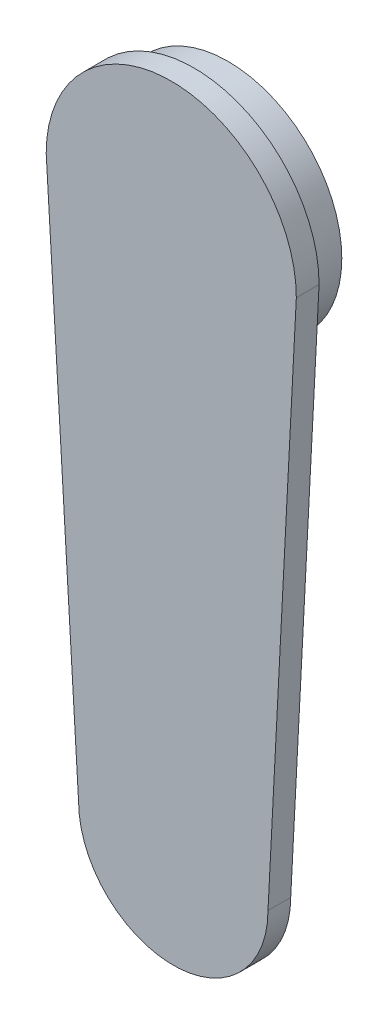
ISO-10303-21;
HEADER;
FILE_DESCRIPTION(('STEP AP214'),'2;1');
FILE_NAME('part.step','',(''),(''),'','','');
FILE_SCHEMA(('AUTOMOTIVE_DESIGN { 1 0 10303 214 1 1 1 1 }'));
ENDSEC;
DATA;
#1=APPLICATION_CONTEXT('core data for automotive mechanical design processes');
#2=APPLICATION_PROTOCOL_DEFINITION('international standard','automotive_design',2000,#1);
#3=PRODUCT_CONTEXT('',#1,'mechanical');
#4=PRODUCT('Part','Part','',(#3));
#5=PRODUCT_RELATED_PRODUCT_CATEGORY('part','',(#4));
#6=PRODUCT_DEFINITION_FORMATION('','',#4);
#7=PRODUCT_DEFINITION_CONTEXT('part definition',#1,'design');
#8=PRODUCT_DEFINITION('design','',#6,#7);
#9=PRODUCT_DEFINITION_SHAPE('','',#8);
#10=(LENGTH_UNIT() NAMED_UNIT(*) SI_UNIT(.MILLI.,.METRE.));
#11=(NAMED_UNIT(*) PLANE_ANGLE_UNIT() SI_UNIT($,.RADIAN.));
#12=(NAMED_UNIT(*) SI_UNIT($,.STERADIAN.) SOLID_ANGLE_UNIT());
#13=UNCERTAINTY_MEASURE_WITH_UNIT(LENGTH_MEASURE(1.E-05),#10,'distance_accuracy_value','');
#14=(GEOMETRIC_REPRESENTATION_CONTEXT(3) GLOBAL_UNCERTAINTY_ASSIGNED_CONTEXT((#13)) GLOBAL_UNIT_ASSIGNED_CONTEXT((#10,
#11,#12)) REPRESENTATION_CONTEXT('',''));
#15=CARTESIAN_POINT('',(0.,0.,0.));
#16=DIRECTION('',(0.,0.,1.));
#17=DIRECTION('',(1.,0.,0.));
#18=AXIS2_PLACEMENT_3D('',#15,#16,#17);
#19=CARTESIAN_POINT('',(54.8515641225065,-2.8534084972915,-0.0001));
#20=DIRECTION('',(0.998649671237995,-0.0519503044865522,0.));
#21=DIRECTION('',(0.0519503044865522,0.998649671237995,0.));
#22=AXIS2_PLACEMENT_3D('',#19,#20,#21);
#23=PLANE('',#22);
#24=DIRECTION('',(0.,0.,1.));
#25=VECTOR('',#24,1.);
#26=CARTESIAN_POINT('',(55.,0.,-0.0001));
#27=LINE('',#26,#25);
#28=CARTESIAN_POINT('',(55.,0.,-0.0001));
#29=VERTEX_POINT('',#28);
#30=CARTESIAN_POINT('',(55.,0.,10.));
#31=VERTEX_POINT('',#30);
#32=EDGE_CURVE('E73',#29,#31,#27,.T.);
#33=ORIENTED_EDGE('',*,*,#32,.T.);
#34=DIRECTION('',(0.0519503044865522,0.998649671237995,0.));
#35=VECTOR('',#34,1.);
#36=CARTESIAN_POINT('',(54.8515641225065,-2.8534084972915,10.));
#37=LINE('',#36,#35);
#38=CARTESIAN_POINT('',(42.5319269232275,-239.675921097119,10.));
#39=VERTEX_POINT('',#38);
#40=EDGE_CURVE('E76',#39,#31,#37,.T.);
#41=ORIENTED_EDGE('',*,*,#40,.F.);
#42=DIRECTION('',(0.,0.,1.));
#43=VECTOR('',#42,1.);
#44=CARTESIAN_POINT('',(42.5319269232275,-239.675921097119,-0.0001));
#45=LINE('',#44,#43);
#46=CARTESIAN_POINT('',(42.5319269232275,-239.675921097119,-0.0001));
#47=VERTEX_POINT('',#46);
#48=EDGE_CURVE('E42',#47,#39,#45,.T.);
#49=ORIENTED_EDGE('',*,*,#48,.F.);
#50=DIRECTION('',(0.0519503044865522,0.998649671237995,0.));
#51=VECTOR('',#50,1.);
#52=CARTESIAN_POINT('',(54.8515641225065,-2.8534084972915,-0.0001));
#53=LINE('',#52,#51);
#54=EDGE_CURVE('E77',#47,#29,#53,.T.);
#55=ORIENTED_EDGE('',*,*,#54,.T.);
#56=EDGE_LOOP('',(#33,#41,#49,#55));
#57=FACE_BOUND('',#56,.T.);
#58=ADVANCED_FACE('F35',(#57),#23,.T.);
#59=CARTESIAN_POINT('',(0.881926923227479,-239.675921097119,-0.0001));
#60=DIRECTION('',(0.,0.,1.));
#61=DIRECTION('',(1.,0.,0.));
#62=AXIS2_PLACEMENT_3D('',#59,#60,#61);
#63=CYLINDRICAL_SURFACE('',#62,41.65);
#64=ORIENTED_EDGE('',*,*,#48,.T.);
#65=CARTESIAN_POINT('',(0.881926923227479,-239.675921097119,10.));
#66=DIRECTION('',(0.,0.,1.));
#67=DIRECTION('',(1.,0.,0.));
#68=AXIS2_PLACEMENT_3D('',#65,#66,#67);
#69=CIRCLE('',#68,41.65);
#70=CARTESIAN_POINT('',(-40.7680730767725,-239.675921097119,10.));
#71=VERTEX_POINT('',#70);
#72=EDGE_CURVE('E93',#71,#39,#69,.T.);
#73=ORIENTED_EDGE('',*,*,#72,.F.);
#74=DIRECTION('',(0.,0.,1.));
#75=VECTOR('',#74,1.);
#76=CARTESIAN_POINT('',(-40.7680730767725,-239.675921097119,-0.0001));
#77=LINE('',#76,#75);
#78=CARTESIAN_POINT('',(-40.7680730767725,-239.675921097119,-0.0001));
#79=VERTEX_POINT('',#78);
#80=EDGE_CURVE('E56',#79,#71,#77,.T.);
#81=ORIENTED_EDGE('',*,*,#80,.F.);
#82=CARTESIAN_POINT('',(0.881926923227479,-239.675921097119,-0.0001));
#83=DIRECTION('',(0.,0.,1.));
#84=DIRECTION('',(1.,0.,0.));
#85=AXIS2_PLACEMENT_3D('',#82,#83,#84);
#86=CIRCLE('',#85,41.65);
#87=EDGE_CURVE('E82',#79,#47,#86,.T.);
#88=ORIENTED_EDGE('',*,*,#87,.T.);
#89=EDGE_LOOP('',(#64,#73,#81,#88));
#90=FACE_BOUND('',#89,.T.);
#91=ADVANCED_FACE('F113',(#90),#63,.T.);
#92=CARTESIAN_POINT('',(-54.8067530386932,-3.25441830191191,-0.0001));
#93=DIRECTION('',(-0.998241663569164,-0.0592754680679025,0.));
#94=DIRECTION('',(0.0592754680679025,-0.998241663569164,0.));
#95=AXIS2_PLACEMENT_3D('',#92,#93,#94);
#96=PLANE('',#95);
#97=ORIENTED_EDGE('',*,*,#80,.T.);
#98=DIRECTION('',(0.0592754680679025,-0.998241663569164,0.));
#99=VECTOR('',#98,1.);
#100=CARTESIAN_POINT('',(-54.8067530386932,-3.25441830191191,10.));
#101=LINE('',#100,#99);
#102=CARTESIAN_POINT('',(-55.,0.,10.));
#103=VERTEX_POINT('',#102);
#104=EDGE_CURVE('E89',#103,#71,#101,.T.);
#105=ORIENTED_EDGE('',*,*,#104,.F.);
#106=DIRECTION('',(0.,0.,1.));
#107=VECTOR('',#106,1.);
#108=CARTESIAN_POINT('',(-55.,0.,-0.0001));
#109=LINE('',#108,#107);
#110=CARTESIAN_POINT('',(-55.,0.,-0.0001));
#111=VERTEX_POINT('',#110);
#112=EDGE_CURVE('E81',#111,#103,#109,.T.);
#113=ORIENTED_EDGE('',*,*,#112,.F.);
#114=DIRECTION('',(0.0592754680679025,-0.998241663569164,0.));
#115=VECTOR('',#114,1.);
#116=CARTESIAN_POINT('',(-54.8067530386932,-3.25441830191191,-0.0001));
#117=LINE('',#116,#115);
#118=EDGE_CURVE('E104',#111,#79,#117,.T.);
#119=ORIENTED_EDGE('',*,*,#118,.T.);
#120=EDGE_LOOP('',(#97,#105,#113,#119));
#121=FACE_BOUND('',#120,.T.);
#122=ADVANCED_FACE('F110',(#121),#96,.T.);
#123=CARTESIAN_POINT('',(0.,0.,-0.0001));
#124=DIRECTION('',(0.,0.,1.));
#125=DIRECTION('',(1.,0.,0.));
#126=AXIS2_PLACEMENT_3D('',#123,#124,#125);
#127=CYLINDRICAL_SURFACE('',#126,55.);
#128=ORIENTED_EDGE('',*,*,#112,.T.);
#129=CARTESIAN_POINT('',(0.,0.,10.));
#130=DIRECTION('',(0.,0.,1.));
#131=DIRECTION('',(1.,0.,0.));
#132=AXIS2_PLACEMENT_3D('',#129,#130,#131);
#133=CIRCLE('',#132,55.);
#134=EDGE_CURVE('E84',#31,#103,#133,.T.);
#135=ORIENTED_EDGE('',*,*,#134,.F.);
#136=ORIENTED_EDGE('',*,*,#32,.F.);
#137=CARTESIAN_POINT('',(0.,0.,-0.0001));
#138=DIRECTION('',(0.,0.,1.));
#139=DIRECTION('',(1.,0.,0.));
#140=AXIS2_PLACEMENT_3D('',#137,#138,#139);
#141=CIRCLE('',#140,55.);
#142=EDGE_CURVE('E102',#29,#111,#141,.T.);
#143=ORIENTED_EDGE('',*,*,#142,.T.);
#144=EDGE_LOOP('',(#128,#135,#136,#143));
#145=FACE_BOUND('',#144,.T.);
#146=ADVANCED_FACE('F85',(#145),#127,.T.);
#147=CARTESIAN_POINT('',(0.,0.,-0.0001));
#148=DIRECTION('',(0.,0.,1.));
#149=DIRECTION('',(1.,0.,0.));
#150=AXIS2_PLACEMENT_3D('',#147,#148,#149);
#151=PLANE('',#150);
#152=CARTESIAN_POINT('',(0.,0.,-9.99999999994061E-05));
#153=DIRECTION('',(0.,0.,1.));
#154=DIRECTION('',(1.,0.,0.));
#155=AXIS2_PLACEMENT_3D('',#152,#153,#154);
#156=CIRCLE('',#155,50.);
#157=CARTESIAN_POINT('',(50.,0.,-9.99999999994061E-05));
#158=VERTEX_POINT('',#157);
#159=EDGE_CURVE('E11',#158,#158,#156,.F.);
#160=ORIENTED_EDGE('',*,*,#159,.F.);
#161=EDGE_LOOP('',(#160));
#162=FACE_BOUND('',#161,.T.);
#163=ORIENTED_EDGE('',*,*,#54,.F.);
#164=ORIENTED_EDGE('',*,*,#87,.F.);
#165=ORIENTED_EDGE('',*,*,#118,.F.);
#166=ORIENTED_EDGE('',*,*,#142,.F.);
#167=EDGE_LOOP('',(#163,#164,#165,#166));
#168=FACE_BOUND('',#167,.T.);
#169=ADVANCED_FACE('F115',(#162,#168),#151,.F.);
#170=CARTESIAN_POINT('',(0.,0.,10.));
#171=DIRECTION('',(0.,0.,1.));
#172=DIRECTION('',(1.,0.,0.));
#173=AXIS2_PLACEMENT_3D('',#170,#171,#172);
#174=PLANE('',#173);
#175=ORIENTED_EDGE('',*,*,#40,.T.);
#176=ORIENTED_EDGE('',*,*,#134,.T.);
#177=ORIENTED_EDGE('',*,*,#104,.T.);
#178=ORIENTED_EDGE('',*,*,#72,.T.);
#179=EDGE_LOOP('',(#175,#176,#177,#178));
#180=FACE_BOUND('',#179,.T.);
#181=ADVANCED_FACE('F92',(#180),#174,.T.);
#182=CARTESIAN_POINT('',(0.,0.,-15.0001));
#183=DIRECTION('',(0.,0.,1.));
#184=DIRECTION('',(1.,0.,0.));
#185=AXIS2_PLACEMENT_3D('',#182,#183,#184);
#186=CYLINDRICAL_SURFACE('',#185,50.);
#187=CARTESIAN_POINT('',(0.,0.,-15.0001));
#188=DIRECTION('',(0.,0.,-1.));
#189=DIRECTION('',(-1.,0.,0.));
#190=AXIS2_PLACEMENT_3D('',#187,#188,#189);
#191=CIRCLE('',#190,50.);
#192=CARTESIAN_POINT('',(-50.,0.,-15.0001));
#193=VERTEX_POINT('',#192);
#194=EDGE_CURVE('E94',#193,#193,#191,.T.);
#195=ORIENTED_EDGE('',*,*,#194,.F.);
#196=EDGE_LOOP('',(#195));
#197=FACE_BOUND('',#196,.T.);
#198=ORIENTED_EDGE('',*,*,#159,.T.);
#199=EDGE_LOOP('',(#198));
#200=FACE_BOUND('',#199,.T.);
#201=ADVANCED_FACE('F123',(#197,#200),#186,.T.);
#202=CARTESIAN_POINT('',(0.,0.,-15.0001));
#203=DIRECTION('',(0.,0.,-1.));
#204=DIRECTION('',(-1.,0.,0.));
#205=AXIS2_PLACEMENT_3D('',#202,#203,#204);
#206=PLANE('',#205);
#207=ORIENTED_EDGE('',*,*,#194,.T.);
#208=EDGE_LOOP('',(#207));
#209=FACE_BOUND('',#208,.T.);
#210=ADVANCED_FACE('F164',(#209),#206,.T.);
#211=CLOSED_SHELL('',(#58,#91,#122,#146,#169,#181,#201,#210));
#212=MANIFOLD_SOLID_BREP('B2',#211);
#213=ADVANCED_BREP_SHAPE_REPRESENTATION('',(#18,#212),#14);
#214=SHAPE_DEFINITION_REPRESENTATION(#9,#213);
ENDSEC;
END-ISO-10303-21;
